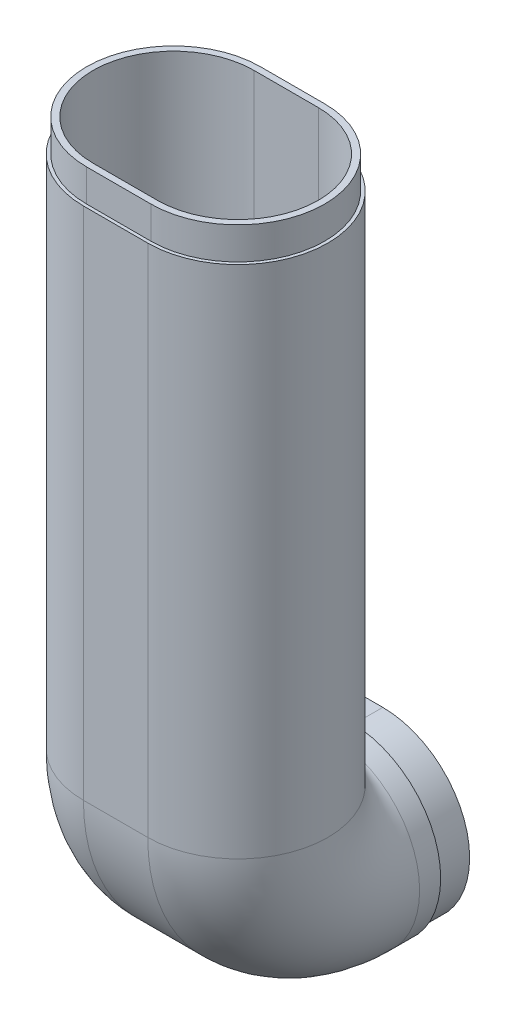
ISO-10303-21;
HEADER;
FILE_DESCRIPTION(('STEP AP214'),'2;1');
FILE_NAME('part.step','',(''),(''),'','','');
FILE_SCHEMA(('AUTOMOTIVE_DESIGN { 1 0 10303 214 1 1 1 1 }'));
ENDSEC;
DATA;
#1=APPLICATION_CONTEXT('core data for automotive mechanical design processes');
#2=APPLICATION_PROTOCOL_DEFINITION('international standard','automotive_design',2000,#1);
#3=PRODUCT_CONTEXT('',#1,'mechanical');
#4=PRODUCT('Part','Part','',(#3));
#5=PRODUCT_RELATED_PRODUCT_CATEGORY('part','',(#4));
#6=PRODUCT_DEFINITION_FORMATION('','',#4);
#7=PRODUCT_DEFINITION_CONTEXT('part definition',#1,'design');
#8=PRODUCT_DEFINITION('design','',#6,#7);
#9=PRODUCT_DEFINITION_SHAPE('','',#8);
#10=(LENGTH_UNIT() NAMED_UNIT(*) SI_UNIT(.MILLI.,.METRE.));
#11=(NAMED_UNIT(*) PLANE_ANGLE_UNIT() SI_UNIT($,.RADIAN.));
#12=(NAMED_UNIT(*) SI_UNIT($,.STERADIAN.) SOLID_ANGLE_UNIT());
#13=UNCERTAINTY_MEASURE_WITH_UNIT(LENGTH_MEASURE(1.E-05),#10,'distance_accuracy_value','');
#14=(GEOMETRIC_REPRESENTATION_CONTEXT(3) GLOBAL_UNCERTAINTY_ASSIGNED_CONTEXT((#13)) GLOBAL_UNIT_ASSIGNED_CONTEXT((#10,
#11,#12)) REPRESENTATION_CONTEXT('',''));
#15=CARTESIAN_POINT('',(0.,0.,0.));
#16=DIRECTION('',(0.,0.,1.));
#17=DIRECTION('',(1.,0.,0.));
#18=AXIS2_PLACEMENT_3D('',#15,#16,#17);
#19=CARTESIAN_POINT('',(-10.,198.51016359835,45.055914581086));
#20=DIRECTION('',(0.,1.,0.));
#21=DIRECTION('',(0.,0.,1.));
#22=AXIS2_PLACEMENT_3D('',#19,#20,#21);
#23=PLANE('',#22);
#24=DIRECTION('',(1.,0.,0.));
#25=VECTOR('',#24,1.);
#26=CARTESIAN_POINT('',(9.99999999999999,198.51016359835,70.0559145810861));
#27=LINE('',#26,#25);
#28=CARTESIAN_POINT('',(-10.,198.51016359835,70.0559145810861));
#29=VERTEX_POINT('',#28);
#30=CARTESIAN_POINT('',(9.99999999999999,198.51016359835,70.0559145810861));
#31=VERTEX_POINT('',#30);
#32=EDGE_CURVE('E279',#29,#31,#27,.T.);
#33=ORIENTED_EDGE('',*,*,#32,.F.);
#34=CARTESIAN_POINT('',(-10.,198.51016359835,45.055914581086));
#35=DIRECTION('',(0.,1.,0.));
#36=DIRECTION('',(0.,0.,1.));
#37=AXIS2_PLACEMENT_3D('',#34,#35,#36);
#38=CIRCLE('',#37,25.);
#39=CARTESIAN_POINT('',(-10.,198.51016359835,20.055914581086));
#40=VERTEX_POINT('',#39);
#41=EDGE_CURVE('E277',#40,#29,#38,.T.);
#42=ORIENTED_EDGE('',*,*,#41,.F.);
#43=DIRECTION('',(-1.,0.,0.));
#44=VECTOR('',#43,1.);
#45=CARTESIAN_POINT('',(9.99999999999999,198.51016359835,20.055914581086));
#46=LINE('',#45,#44);
#47=CARTESIAN_POINT('',(9.99999999999999,198.51016359835,20.055914581086));
#48=VERTEX_POINT('',#47);
#49=EDGE_CURVE('E284',#48,#40,#46,.T.);
#50=ORIENTED_EDGE('',*,*,#49,.F.);
#51=CARTESIAN_POINT('',(9.99999999999999,198.51016359835,45.055914581086));
#52=DIRECTION('',(0.,1.,0.));
#53=DIRECTION('',(0.,0.,1.));
#54=AXIS2_PLACEMENT_3D('',#51,#52,#53);
#55=CIRCLE('',#54,25.);
#56=EDGE_CURVE('E281',#31,#48,#55,.T.);
#57=ORIENTED_EDGE('',*,*,#56,.F.);
#58=EDGE_LOOP('',(#33,#42,#50,#57));
#59=FACE_BOUND('',#58,.T.);
#60=DIRECTION('',(-1.,0.,0.));
#61=VECTOR('',#60,1.);
#62=CARTESIAN_POINT('',(10.,198.51016359835,18.055914581086));
#63=LINE('',#62,#61);
#64=CARTESIAN_POINT('',(10.,198.51016359835,18.055914581086));
#65=VERTEX_POINT('',#64);
#66=CARTESIAN_POINT('',(-10.,198.51016359835,18.055914581086));
#67=VERTEX_POINT('',#66);
#68=EDGE_CURVE('E218',#65,#67,#63,.T.);
#69=ORIENTED_EDGE('',*,*,#68,.T.);
#70=CARTESIAN_POINT('',(-10.,198.51016359835,45.055914581086));
#71=DIRECTION('',(0.,1.,0.));
#72=DIRECTION('',(0.,0.,1.));
#73=AXIS2_PLACEMENT_3D('',#70,#71,#72);
#74=CIRCLE('',#73,27.);
#75=CARTESIAN_POINT('',(-10.,198.51016359835,72.0559145810861));
#76=VERTEX_POINT('',#75);
#77=EDGE_CURVE('E225',#67,#76,#74,.T.);
#78=ORIENTED_EDGE('',*,*,#77,.T.);
#79=DIRECTION('',(1.,0.,0.));
#80=VECTOR('',#79,1.);
#81=CARTESIAN_POINT('',(10.,198.51016359835,72.0559145810861));
#82=LINE('',#81,#80);
#83=CARTESIAN_POINT('',(10.,198.51016359835,72.0559145810861));
#84=VERTEX_POINT('',#83);
#85=EDGE_CURVE('E199',#76,#84,#82,.T.);
#86=ORIENTED_EDGE('',*,*,#85,.T.);
#87=CARTESIAN_POINT('',(10.,198.51016359835,45.055914581086));
#88=DIRECTION('',(0.,1.,0.));
#89=DIRECTION('',(0.,0.,-1.));
#90=AXIS2_PLACEMENT_3D('',#87,#88,#89);
#91=CIRCLE('',#90,27.);
#92=EDGE_CURVE('E48',#84,#65,#91,.T.);
#93=ORIENTED_EDGE('',*,*,#92,.T.);
#94=EDGE_LOOP('',(#69,#78,#86,#93));
#95=FACE_BOUND('',#94,.T.);
#96=ADVANCED_FACE('F33',(#59,#95),#23,.T.);
#97=CARTESIAN_POINT('',(-10.,198.51016359835,45.055914581086));
#98=DIRECTION('',(0.,-1.,0.));
#99=DIRECTION('',(0.,0.,-1.));
#100=AXIS2_PLACEMENT_3D('',#97,#98,#99);
#101=CYLINDRICAL_SURFACE('',#100,28.);
#102=CARTESIAN_POINT('',(-10.,188.51016359835,45.055914581086));
#103=DIRECTION('',(0.,1.,0.));
#104=DIRECTION('',(0.,0.,1.));
#105=AXIS2_PLACEMENT_3D('',#102,#103,#104);
#106=CIRCLE('',#105,28.);
#107=CARTESIAN_POINT('',(-10.,188.51016359835,17.055914581086));
#108=VERTEX_POINT('',#107);
#109=CARTESIAN_POINT('',(-10.,188.51016359835,73.055914581086));
#110=VERTEX_POINT('',#109);
#111=EDGE_CURVE('E236',#108,#110,#106,.T.);
#112=ORIENTED_EDGE('',*,*,#111,.F.);
#113=DIRECTION('',(0.,-1.,0.));
#114=VECTOR('',#113,1.);
#115=CARTESIAN_POINT('',(-10.,198.51016359835,17.055914581086));
#116=LINE('',#115,#114);
#117=CARTESIAN_POINT('',(-10.,28.5101635983498,17.055914581086));
#118=VERTEX_POINT('',#117);
#119=EDGE_CURVE('E298',#108,#118,#116,.T.);
#120=ORIENTED_EDGE('',*,*,#119,.T.);
#121=CARTESIAN_POINT('',(-10.,28.5101635983498,45.055914581086));
#122=DIRECTION('',(0.,1.,0.));
#123=DIRECTION('',(1.,0.,0.));
#124=AXIS2_PLACEMENT_3D('',#121,#122,#123);
#125=CIRCLE('',#124,28.);
#126=CARTESIAN_POINT('',(-10.,28.5101635983498,73.055914581086));
#127=VERTEX_POINT('',#126);
#128=EDGE_CURVE('E352',#118,#127,#125,.T.);
#129=ORIENTED_EDGE('',*,*,#128,.T.);
#130=DIRECTION('',(0.,-1.,0.));
#131=VECTOR('',#130,1.);
#132=CARTESIAN_POINT('',(-10.,198.51016359835,73.055914581086));
#133=LINE('',#132,#131);
#134=EDGE_CURVE('E304',#110,#127,#133,.T.);
#135=ORIENTED_EDGE('',*,*,#134,.F.);
#136=EDGE_LOOP('',(#112,#120,#129,#135));
#137=FACE_BOUND('',#136,.T.);
#138=ADVANCED_FACE('F453',(#137),#101,.T.);
#139=CARTESIAN_POINT('',(9.99999999999999,198.51016359835,73.055914581086));
#140=DIRECTION('',(0.,0.,-1.));
#141=DIRECTION('',(-1.,0.,0.));
#142=AXIS2_PLACEMENT_3D('',#139,#140,#141);
#143=PLANE('',#142);
#144=DIRECTION('',(1.,0.,0.));
#145=VECTOR('',#144,1.);
#146=CARTESIAN_POINT('',(9.99999999999999,188.51016359835,73.055914581086));
#147=LINE('',#146,#145);
#148=CARTESIAN_POINT('',(9.99999999999999,188.51016359835,73.055914581086));
#149=VERTEX_POINT('',#148);
#150=EDGE_CURVE('E234',#110,#149,#147,.T.);
#151=ORIENTED_EDGE('',*,*,#150,.F.);
#152=ORIENTED_EDGE('',*,*,#134,.T.);
#153=DIRECTION('',(1.,0.,0.));
#154=VECTOR('',#153,1.);
#155=CARTESIAN_POINT('',(-10.,28.5101635983498,73.055914581086));
#156=LINE('',#155,#154);
#157=CARTESIAN_POINT('',(9.99999999999999,28.5101635983498,73.055914581086));
#158=VERTEX_POINT('',#157);
#159=EDGE_CURVE('E349',#127,#158,#156,.T.);
#160=ORIENTED_EDGE('',*,*,#159,.T.);
#161=DIRECTION('',(0.,-1.,0.));
#162=VECTOR('',#161,1.);
#163=CARTESIAN_POINT('',(9.99999999999999,198.51016359835,73.055914581086));
#164=LINE('',#163,#162);
#165=EDGE_CURVE('E302',#149,#158,#164,.T.);
#166=ORIENTED_EDGE('',*,*,#165,.F.);
#167=EDGE_LOOP('',(#151,#152,#160,#166));
#168=FACE_BOUND('',#167,.T.);
#169=ADVANCED_FACE('F459',(#168),#143,.F.);
#170=CARTESIAN_POINT('',(9.99999999999999,198.51016359835,45.055914581086));
#171=DIRECTION('',(0.,-1.,0.));
#172=DIRECTION('',(0.,0.,-1.));
#173=AXIS2_PLACEMENT_3D('',#170,#171,#172);
#174=CYLINDRICAL_SURFACE('',#173,28.);
#175=CARTESIAN_POINT('',(9.99999999999999,188.51016359835,45.055914581086));
#176=DIRECTION('',(0.,1.,0.));
#177=DIRECTION('',(0.,0.,1.));
#178=AXIS2_PLACEMENT_3D('',#175,#176,#177);
#179=CIRCLE('',#178,28.);
#180=CARTESIAN_POINT('',(9.99999999999999,188.51016359835,17.055914581086));
#181=VERTEX_POINT('',#180);
#182=EDGE_CURVE('E55',#149,#181,#179,.T.);
#183=ORIENTED_EDGE('',*,*,#182,.F.);
#184=ORIENTED_EDGE('',*,*,#165,.T.);
#185=CARTESIAN_POINT('',(9.99999999999999,28.5101635983498,45.055914581086));
#186=DIRECTION('',(0.,1.,0.));
#187=DIRECTION('',(1.,0.,0.));
#188=AXIS2_PLACEMENT_3D('',#185,#186,#187);
#189=CIRCLE('',#188,28.);
#190=CARTESIAN_POINT('',(10.,28.5101635983498,17.055914581086));
#191=VERTEX_POINT('',#190);
#192=EDGE_CURVE('E346',#158,#191,#189,.T.);
#193=ORIENTED_EDGE('',*,*,#192,.T.);
#194=DIRECTION('',(0.,-1.,0.));
#195=VECTOR('',#194,1.);
#196=CARTESIAN_POINT('',(9.99999999999999,198.51016359835,17.055914581086));
#197=LINE('',#196,#195);
#198=EDGE_CURVE('E300',#181,#191,#197,.T.);
#199=ORIENTED_EDGE('',*,*,#198,.F.);
#200=EDGE_LOOP('',(#183,#184,#193,#199));
#201=FACE_BOUND('',#200,.T.);
#202=ADVANCED_FACE('F470',(#201),#174,.T.);
#203=CARTESIAN_POINT('',(9.99999999999999,198.51016359835,17.055914581086));
#204=DIRECTION('',(0.,0.,1.));
#205=DIRECTION('',(1.,0.,0.));
#206=AXIS2_PLACEMENT_3D('',#203,#204,#205);
#207=PLANE('',#206);
#208=DIRECTION('',(-1.,0.,0.));
#209=VECTOR('',#208,1.);
#210=CARTESIAN_POINT('',(9.99999999999999,188.51016359835,17.055914581086));
#211=LINE('',#210,#209);
#212=EDGE_CURVE('E11',#181,#108,#211,.T.);
#213=ORIENTED_EDGE('',*,*,#212,.F.);
#214=ORIENTED_EDGE('',*,*,#198,.T.);
#215=DIRECTION('',(-1.,0.,0.));
#216=VECTOR('',#215,1.);
#217=CARTESIAN_POINT('',(10.,28.5101635983498,17.055914581086));
#218=LINE('',#217,#216);
#219=EDGE_CURVE('E311',#191,#118,#218,.T.);
#220=ORIENTED_EDGE('',*,*,#219,.T.);
#221=ORIENTED_EDGE('',*,*,#119,.F.);
#222=EDGE_LOOP('',(#213,#214,#220,#221));
#223=FACE_BOUND('',#222,.T.);
#224=ADVANCED_FACE('F449',(#223),#207,.F.);
#225=CARTESIAN_POINT('',(-10.,0.,0.));
#226=DIRECTION('',(0.,0.,1.));
#227=DIRECTION('',(1.,0.,0.));
#228=AXIS2_PLACEMENT_3D('',#225,#226,#227);
#229=PLANE('',#228);
#230=CARTESIAN_POINT('',(-10.,0.,0.));
#231=DIRECTION('',(0.,0.,1.));
#232=DIRECTION('',(1.,0.,0.));
#233=AXIS2_PLACEMENT_3D('',#230,#231,#232);
#234=CIRCLE('',#233,25.);
#235=CARTESIAN_POINT('',(-10.,25.,0.));
#236=VERTEX_POINT('',#235);
#237=CARTESIAN_POINT('',(-10.,-25.,0.));
#238=VERTEX_POINT('',#237);
#239=EDGE_CURVE('E343',#236,#238,#234,.T.);
#240=ORIENTED_EDGE('',*,*,#239,.T.);
#241=DIRECTION('',(1.,0.,0.));
#242=VECTOR('',#241,1.);
#243=CARTESIAN_POINT('',(10.,-25.,0.));
#244=LINE('',#243,#242);
#245=CARTESIAN_POINT('',(9.99999999999999,-25.,0.));
#246=VERTEX_POINT('',#245);
#247=EDGE_CURVE('E380',#238,#246,#244,.T.);
#248=ORIENTED_EDGE('',*,*,#247,.T.);
#249=CARTESIAN_POINT('',(9.99999999999999,0.,0.));
#250=DIRECTION('',(0.,0.,1.));
#251=DIRECTION('',(1.,0.,0.));
#252=AXIS2_PLACEMENT_3D('',#249,#250,#251);
#253=CIRCLE('',#252,25.);
#254=CARTESIAN_POINT('',(10.,25.,0.));
#255=VERTEX_POINT('',#254);
#256=EDGE_CURVE('E383',#246,#255,#253,.T.);
#257=ORIENTED_EDGE('',*,*,#256,.T.);
#258=DIRECTION('',(-1.,0.,0.));
#259=VECTOR('',#258,1.);
#260=CARTESIAN_POINT('',(10.,25.,0.));
#261=LINE('',#260,#259);
#262=EDGE_CURVE('E386',#255,#236,#261,.T.);
#263=ORIENTED_EDGE('',*,*,#262,.T.);
#264=EDGE_LOOP('',(#240,#248,#257,#263));
#265=FACE_BOUND('',#264,.T.);
#266=CARTESIAN_POINT('',(10.,0.,0.));
#267=DIRECTION('',(0.,0.,-1.));
#268=DIRECTION('',(-1.,0.,0.));
#269=AXIS2_PLACEMENT_3D('',#266,#267,#268);
#270=CIRCLE('',#269,27.);
#271=CARTESIAN_POINT('',(10.,27.,0.));
#272=VERTEX_POINT('',#271);
#273=CARTESIAN_POINT('',(10.,-27.,0.));
#274=VERTEX_POINT('',#273);
#275=EDGE_CURVE('E238',#272,#274,#270,.T.);
#276=ORIENTED_EDGE('',*,*,#275,.T.);
#277=DIRECTION('',(-1.,0.,0.));
#278=VECTOR('',#277,1.);
#279=CARTESIAN_POINT('',(-10.,-27.,0.));
#280=LINE('',#279,#278);
#281=CARTESIAN_POINT('',(-10.,-27.,0.));
#282=VERTEX_POINT('',#281);
#283=EDGE_CURVE('E255',#274,#282,#280,.T.);
#284=ORIENTED_EDGE('',*,*,#283,.T.);
#285=CARTESIAN_POINT('',(-10.,0.,0.));
#286=DIRECTION('',(0.,0.,-1.));
#287=DIRECTION('',(1.,0.,0.));
#288=AXIS2_PLACEMENT_3D('',#285,#286,#287);
#289=CIRCLE('',#288,27.);
#290=CARTESIAN_POINT('',(-10.,27.,0.));
#291=VERTEX_POINT('',#290);
#292=EDGE_CURVE('E258',#282,#291,#289,.T.);
#293=ORIENTED_EDGE('',*,*,#292,.T.);
#294=DIRECTION('',(1.,0.,0.));
#295=VECTOR('',#294,1.);
#296=CARTESIAN_POINT('',(-10.,27.,0.));
#297=LINE('',#296,#295);
#298=EDGE_CURVE('E243',#291,#272,#297,.T.);
#299=ORIENTED_EDGE('',*,*,#298,.T.);
#300=EDGE_LOOP('',(#276,#284,#293,#299));
#301=FACE_BOUND('',#300,.T.);
#302=ADVANCED_FACE('F444',(#265,#301),#229,.F.);
#303=CARTESIAN_POINT('',(-10.,0.,12.));
#304=DIRECTION('',(0.,0.,-1.));
#305=DIRECTION('',(-1.,0.,0.));
#306=AXIS2_PLACEMENT_3D('',#303,#304,#305);
#307=CYLINDRICAL_SURFACE('',#306,28.);
#308=CARTESIAN_POINT('',(-10.,0.,10.));
#309=DIRECTION('',(0.,0.,-1.));
#310=DIRECTION('',(-1.,0.,0.));
#311=AXIS2_PLACEMENT_3D('',#308,#309,#310);
#312=CIRCLE('',#311,28.);
#313=CARTESIAN_POINT('',(-10.,-28.,10.));
#314=VERTEX_POINT('',#313);
#315=CARTESIAN_POINT('',(-10.,28.,10.));
#316=VERTEX_POINT('',#315);
#317=EDGE_CURVE('E275',#314,#316,#312,.T.);
#318=ORIENTED_EDGE('',*,*,#317,.F.);
#319=DIRECTION('',(0.,0.,-1.));
#320=VECTOR('',#319,1.);
#321=CARTESIAN_POINT('',(-10.,-28.,12.));
#322=LINE('',#321,#320);
#323=CARTESIAN_POINT('',(-10.,-28.,16.5457509827363));
#324=VERTEX_POINT('',#323);
#325=EDGE_CURVE('E408',#324,#314,#322,.T.);
#326=ORIENTED_EDGE('',*,*,#325,.F.);
#327=CARTESIAN_POINT('',(-10.,0.,16.5457509827363));
#328=DIRECTION('',(0.,0.,1.));
#329=DIRECTION('',(1.,0.,0.));
#330=AXIS2_PLACEMENT_3D('',#327,#328,#329);
#331=CIRCLE('',#330,28.);
#332=CARTESIAN_POINT('',(-10.,28.,16.5457509827363));
#333=VERTEX_POINT('',#332);
#334=EDGE_CURVE('E358',#333,#324,#331,.T.);
#335=ORIENTED_EDGE('',*,*,#334,.F.);
#336=DIRECTION('',(0.,0.,-1.));
#337=VECTOR('',#336,1.);
#338=CARTESIAN_POINT('',(-10.,28.,12.));
#339=LINE('',#338,#337);
#340=EDGE_CURVE('E399',#333,#316,#339,.T.);
#341=ORIENTED_EDGE('',*,*,#340,.T.);
#342=EDGE_LOOP('',(#318,#326,#335,#341));
#343=FACE_BOUND('',#342,.T.);
#344=ADVANCED_FACE('F35',(#343),#307,.T.);
#345=CARTESIAN_POINT('',(9.99999999999999,-28.,12.));
#346=DIRECTION('',(0.,1.,0.));
#347=DIRECTION('',(-1.,0.,0.));
#348=AXIS2_PLACEMENT_3D('',#345,#346,#347);
#349=PLANE('',#348);
#350=DIRECTION('',(-1.,0.,0.));
#351=VECTOR('',#350,1.);
#352=CARTESIAN_POINT('',(9.99999999999999,-28.,10.));
#353=LINE('',#352,#351);
#354=CARTESIAN_POINT('',(9.99999999999999,-28.,10.));
#355=VERTEX_POINT('',#354);
#356=EDGE_CURVE('E273',#355,#314,#353,.T.);
#357=ORIENTED_EDGE('',*,*,#356,.F.);
#358=DIRECTION('',(0.,0.,-1.));
#359=VECTOR('',#358,1.);
#360=CARTESIAN_POINT('',(9.99999999999999,-28.,12.));
#361=LINE('',#360,#359);
#362=CARTESIAN_POINT('',(9.99999999999999,-28.,16.5457509827363));
#363=VERTEX_POINT('',#362);
#364=EDGE_CURVE('E405',#363,#355,#361,.T.);
#365=ORIENTED_EDGE('',*,*,#364,.F.);
#366=DIRECTION('',(1.,0.,0.));
#367=VECTOR('',#366,1.);
#368=CARTESIAN_POINT('',(-10.,-28.,16.5457509827363));
#369=LINE('',#368,#367);
#370=EDGE_CURVE('E369',#324,#363,#369,.T.);
#371=ORIENTED_EDGE('',*,*,#370,.F.);
#372=ORIENTED_EDGE('',*,*,#325,.T.);
#373=EDGE_LOOP('',(#357,#365,#371,#372));
#374=FACE_BOUND('',#373,.T.);
#375=ADVANCED_FACE('F438',(#374),#349,.F.);
#376=CARTESIAN_POINT('',(9.99999999999999,0.,12.));
#377=DIRECTION('',(0.,0.,-1.));
#378=DIRECTION('',(-1.,0.,0.));
#379=AXIS2_PLACEMENT_3D('',#376,#377,#378);
#380=CYLINDRICAL_SURFACE('',#379,28.);
#381=CARTESIAN_POINT('',(9.99999999999999,0.,10.));
#382=DIRECTION('',(0.,0.,-1.));
#383=DIRECTION('',(-1.,0.,0.));
#384=AXIS2_PLACEMENT_3D('',#381,#382,#383);
#385=CIRCLE('',#384,28.);
#386=CARTESIAN_POINT('',(10.,28.,10.));
#387=VERTEX_POINT('',#386);
#388=EDGE_CURVE('E265',#387,#355,#385,.T.);
#389=ORIENTED_EDGE('',*,*,#388,.F.);
#390=DIRECTION('',(0.,0.,-1.));
#391=VECTOR('',#390,1.);
#392=CARTESIAN_POINT('',(9.99999999999999,28.,12.));
#393=LINE('',#392,#391);
#394=CARTESIAN_POINT('',(10.,28.,16.5457509827363));
#395=VERTEX_POINT('',#394);
#396=EDGE_CURVE('E402',#395,#387,#393,.T.);
#397=ORIENTED_EDGE('',*,*,#396,.F.);
#398=CARTESIAN_POINT('',(9.99999999999999,0.,16.5457509827363));
#399=DIRECTION('',(0.,0.,1.));
#400=DIRECTION('',(1.,0.,0.));
#401=AXIS2_PLACEMENT_3D('',#398,#399,#400);
#402=CIRCLE('',#401,28.);
#403=EDGE_CURVE('E366',#363,#395,#402,.T.);
#404=ORIENTED_EDGE('',*,*,#403,.F.);
#405=ORIENTED_EDGE('',*,*,#364,.T.);
#406=EDGE_LOOP('',(#389,#397,#404,#405));
#407=FACE_BOUND('',#406,.T.);
#408=ADVANCED_FACE('F418',(#407),#380,.T.);
#409=CARTESIAN_POINT('',(9.99999999999999,28.,12.));
#410=DIRECTION('',(0.,-1.,0.));
#411=DIRECTION('',(0.,0.,-1.));
#412=AXIS2_PLACEMENT_3D('',#409,#410,#411);
#413=PLANE('',#412);
#414=DIRECTION('',(1.,0.,0.));
#415=VECTOR('',#414,1.);
#416=CARTESIAN_POINT('',(9.99999999999999,28.,10.));
#417=LINE('',#416,#415);
#418=EDGE_CURVE('E41',#316,#387,#417,.T.);
#419=ORIENTED_EDGE('',*,*,#418,.F.);
#420=ORIENTED_EDGE('',*,*,#340,.F.);
#421=DIRECTION('',(-1.,0.,0.));
#422=VECTOR('',#421,1.);
#423=CARTESIAN_POINT('',(10.,28.,16.5457509827363));
#424=LINE('',#423,#422);
#425=EDGE_CURVE('E306',#395,#333,#424,.T.);
#426=ORIENTED_EDGE('',*,*,#425,.F.);
#427=ORIENTED_EDGE('',*,*,#396,.T.);
#428=EDGE_LOOP('',(#419,#420,#426,#427));
#429=FACE_BOUND('',#428,.T.);
#430=ADVANCED_FACE('F422',(#429),#413,.F.);
#431=CARTESIAN_POINT('',(-10.,0.,12.));
#432=DIRECTION('',(0.,0.,-1.));
#433=DIRECTION('',(-1.,0.,0.));
#434=AXIS2_PLACEMENT_3D('',#431,#432,#433);
#435=CYLINDRICAL_SURFACE('',#434,25.);
#436=ORIENTED_EDGE('',*,*,#239,.F.);
#437=DIRECTION('',(0.,0.,-1.));
#438=VECTOR('',#437,1.);
#439=CARTESIAN_POINT('',(-10.,25.,12.));
#440=LINE('',#439,#438);
#441=CARTESIAN_POINT('',(-10.,25.,16.5457509827363));
#442=VERTEX_POINT('',#441);
#443=EDGE_CURVE('E389',#442,#236,#440,.T.);
#444=ORIENTED_EDGE('',*,*,#443,.F.);
#445=CARTESIAN_POINT('',(-10.,0.,16.5457509827363));
#446=DIRECTION('',(0.,0.,1.));
#447=DIRECTION('',(1.,0.,0.));
#448=AXIS2_PLACEMENT_3D('',#445,#446,#447);
#449=CIRCLE('',#448,25.);
#450=CARTESIAN_POINT('',(-10.,-25.,16.5457509827363));
#451=VERTEX_POINT('',#450);
#452=EDGE_CURVE('E324',#451,#442,#449,.F.);
#453=ORIENTED_EDGE('',*,*,#452,.F.);
#454=DIRECTION('',(0.,0.,-1.));
#455=VECTOR('',#454,1.);
#456=CARTESIAN_POINT('',(-10.,-25.,12.));
#457=LINE('',#456,#455);
#458=EDGE_CURVE('E396',#451,#238,#457,.T.);
#459=ORIENTED_EDGE('',*,*,#458,.T.);
#460=EDGE_LOOP('',(#436,#444,#453,#459));
#461=FACE_BOUND('',#460,.T.);
#462=ADVANCED_FACE('F513',(#461),#435,.F.);
#463=CARTESIAN_POINT('',(10.,-25.,12.));
#464=DIRECTION('',(0.,1.,0.));
#465=DIRECTION('',(0.,0.,1.));
#466=AXIS2_PLACEMENT_3D('',#463,#464,#465);
#467=PLANE('',#466);
#468=ORIENTED_EDGE('',*,*,#247,.F.);
#469=ORIENTED_EDGE('',*,*,#458,.F.);
#470=DIRECTION('',(1.,0.,0.));
#471=VECTOR('',#470,1.);
#472=CARTESIAN_POINT('',(-10.,-25.,16.5457509827363));
#473=LINE('',#472,#471);
#474=CARTESIAN_POINT('',(9.99999999999999,-25.,16.5457509827363));
#475=VERTEX_POINT('',#474);
#476=EDGE_CURVE('E310',#475,#451,#473,.F.);
#477=ORIENTED_EDGE('',*,*,#476,.F.);
#478=DIRECTION('',(0.,0.,-1.));
#479=VECTOR('',#478,1.);
#480=CARTESIAN_POINT('',(9.99999999999999,-25.,12.));
#481=LINE('',#480,#479);
#482=EDGE_CURVE('E394',#475,#246,#481,.T.);
#483=ORIENTED_EDGE('',*,*,#482,.T.);
#484=EDGE_LOOP('',(#468,#469,#477,#483));
#485=FACE_BOUND('',#484,.T.);
#486=ADVANCED_FACE('F509',(#485),#467,.T.);
#487=CARTESIAN_POINT('',(9.99999999999999,0.,12.));
#488=DIRECTION('',(0.,0.,-1.));
#489=DIRECTION('',(-1.,0.,0.));
#490=AXIS2_PLACEMENT_3D('',#487,#488,#489);
#491=CYLINDRICAL_SURFACE('',#490,25.);
#492=ORIENTED_EDGE('',*,*,#256,.F.);
#493=ORIENTED_EDGE('',*,*,#482,.F.);
#494=CARTESIAN_POINT('',(9.99999999999999,0.,16.5457509827363));
#495=DIRECTION('',(0.,0.,1.));
#496=DIRECTION('',(1.,0.,0.));
#497=AXIS2_PLACEMENT_3D('',#494,#495,#496);
#498=CIRCLE('',#497,25.);
#499=CARTESIAN_POINT('',(10.,25.,16.5457509827363));
#500=VERTEX_POINT('',#499);
#501=EDGE_CURVE('E307',#500,#475,#498,.F.);
#502=ORIENTED_EDGE('',*,*,#501,.F.);
#503=DIRECTION('',(0.,0.,-1.));
#504=VECTOR('',#503,1.);
#505=CARTESIAN_POINT('',(10.,25.,12.));
#506=LINE('',#505,#504);
#507=EDGE_CURVE('E392',#500,#255,#506,.T.);
#508=ORIENTED_EDGE('',*,*,#507,.T.);
#509=EDGE_LOOP('',(#492,#493,#502,#508));
#510=FACE_BOUND('',#509,.T.);
#511=ADVANCED_FACE('F505',(#510),#491,.F.);
#512=CARTESIAN_POINT('',(10.,25.,12.));
#513=DIRECTION('',(0.,-1.,0.));
#514=DIRECTION('',(0.,0.,-1.));
#515=AXIS2_PLACEMENT_3D('',#512,#513,#514);
#516=PLANE('',#515);
#517=ORIENTED_EDGE('',*,*,#262,.F.);
#518=ORIENTED_EDGE('',*,*,#507,.F.);
#519=DIRECTION('',(-1.,0.,0.));
#520=VECTOR('',#519,1.);
#521=CARTESIAN_POINT('',(10.,25.,16.5457509827363));
#522=LINE('',#521,#520);
#523=EDGE_CURVE('E321',#442,#500,#522,.F.);
#524=ORIENTED_EDGE('',*,*,#523,.F.);
#525=ORIENTED_EDGE('',*,*,#443,.T.);
#526=EDGE_LOOP('',(#517,#518,#524,#525));
#527=FACE_BOUND('',#526,.T.);
#528=ADVANCED_FACE('F494',(#527),#516,.T.);
#529=CARTESIAN_POINT('',(0.,28.5101635983498,16.5457509827363));
#530=DIRECTION('',(-1.,0.,0.));
#531=DIRECTION('',(0.,0.,1.));
#532=AXIS2_PLACEMENT_3D('',#529,#530,#531);
#533=CYLINDRICAL_SURFACE('',#532,0.510163598349786);
#534=CARTESIAN_POINT('',(-10.,28.5101635983498,16.5457509827363));
#535=DIRECTION('',(-1.,0.,0.));
#536=DIRECTION('',(0.,-1.,0.));
#537=AXIS2_PLACEMENT_3D('',#534,#535,#536);
#538=CIRCLE('',#537,0.510163598349784);
#539=EDGE_CURVE('E359',#333,#118,#538,.T.);
#540=ORIENTED_EDGE('',*,*,#539,.T.);
#541=ORIENTED_EDGE('',*,*,#219,.F.);
#542=CARTESIAN_POINT('',(10.,28.5101635983498,16.5457509827363));
#543=DIRECTION('',(-1.,0.,0.));
#544=DIRECTION('',(0.,-1.,0.));
#545=AXIS2_PLACEMENT_3D('',#542,#543,#544);
#546=CIRCLE('',#545,0.510163598349787);
#547=EDGE_CURVE('E363',#395,#191,#546,.T.);
#548=ORIENTED_EDGE('',*,*,#547,.F.);
#549=ORIENTED_EDGE('',*,*,#425,.T.);
#550=EDGE_LOOP('',(#540,#541,#548,#549));
#551=FACE_BOUND('',#550,.T.);
#552=ADVANCED_FACE('F425',(#551),#533,.F.);
#553=CARTESIAN_POINT('',(-10.,28.5101635983498,16.5457509827363));
#554=DIRECTION('',(-1.,0.,0.));
#555=DIRECTION('',(0.,0.,1.));
#556=AXIS2_PLACEMENT_3D('',#553,#554,#555);
#557=TOROIDAL_SURFACE('',#556,28.5101635983498,28.);
#558=CARTESIAN_POINT('',(-10.,28.5101635983498,16.5457509827363));
#559=DIRECTION('',(-1.,0.,0.));
#560=DIRECTION('',(0.,-1.,0.));
#561=AXIS2_PLACEMENT_3D('',#558,#559,#560);
#562=CIRCLE('',#561,56.5101635983498);
#563=EDGE_CURVE('E362',#324,#127,#562,.T.);
#564=ORIENTED_EDGE('',*,*,#563,.T.);
#565=ORIENTED_EDGE('',*,*,#128,.F.);
#566=ORIENTED_EDGE('',*,*,#539,.F.);
#567=ORIENTED_EDGE('',*,*,#334,.T.);
#568=EDGE_LOOP('',(#564,#565,#566,#567));
#569=FACE_BOUND('',#568,.T.);
#570=ADVANCED_FACE('F441',(#569),#557,.T.);
#571=CARTESIAN_POINT('',(0.,28.5101635983498,16.5457509827363));
#572=DIRECTION('',(-1.,0.,0.));
#573=DIRECTION('',(0.,0.,1.));
#574=AXIS2_PLACEMENT_3D('',#571,#572,#573);
#575=CYLINDRICAL_SURFACE('',#574,56.5101635983498);
#576=CARTESIAN_POINT('',(9.99999999999999,28.5101635983498,16.5457509827363));
#577=DIRECTION('',(-1.,0.,0.));
#578=DIRECTION('',(0.,-1.,0.));
#579=AXIS2_PLACEMENT_3D('',#576,#577,#578);
#580=CIRCLE('',#579,56.5101635983498);
#581=EDGE_CURVE('E355',#363,#158,#580,.T.);
#582=ORIENTED_EDGE('',*,*,#581,.T.);
#583=ORIENTED_EDGE('',*,*,#159,.F.);
#584=ORIENTED_EDGE('',*,*,#563,.F.);
#585=ORIENTED_EDGE('',*,*,#370,.T.);
#586=EDGE_LOOP('',(#582,#583,#584,#585));
#587=FACE_BOUND('',#586,.T.);
#588=ADVANCED_FACE('F435',(#587),#575,.T.);
#589=CARTESIAN_POINT('',(9.99999999999999,28.5101635983498,16.5457509827363));
#590=DIRECTION('',(-1.,0.,0.));
#591=DIRECTION('',(0.,0.,1.));
#592=AXIS2_PLACEMENT_3D('',#589,#590,#591);
#593=TOROIDAL_SURFACE('',#592,28.5101635983498,28.);
#594=ORIENTED_EDGE('',*,*,#192,.F.);
#595=ORIENTED_EDGE('',*,*,#581,.F.);
#596=ORIENTED_EDGE('',*,*,#403,.T.);
#597=ORIENTED_EDGE('',*,*,#547,.T.);
#598=EDGE_LOOP('',(#594,#595,#596,#597));
#599=FACE_BOUND('',#598,.T.);
#600=ADVANCED_FACE('F431',(#599),#593,.T.);
#601=CARTESIAN_POINT('',(9.99999999999999,28.5101635983498,16.5457509827363));
#602=DIRECTION('',(-1.,0.,0.));
#603=DIRECTION('',(0.,0.,1.));
#604=AXIS2_PLACEMENT_3D('',#601,#602,#603);
#605=TOROIDAL_SURFACE('',#604,28.5101635983498,25.);
#606=CARTESIAN_POINT('',(9.99999999999999,28.5101635983498,16.5457509827363));
#607=DIRECTION('',(-1.,0.,0.));
#608=DIRECTION('',(0.,-1.,0.));
#609=AXIS2_PLACEMENT_3D('',#606,#607,#608);
#610=CIRCLE('',#609,53.5101635983498);
#611=CARTESIAN_POINT('',(9.99999999999999,28.5101635983498,70.055914581086));
#612=VERTEX_POINT('',#611);
#613=EDGE_CURVE('E315',#475,#612,#610,.T.);
#614=ORIENTED_EDGE('',*,*,#613,.T.);
#615=CARTESIAN_POINT('',(9.99999999999999,28.5101635983498,45.055914581086));
#616=DIRECTION('',(0.,1.,0.));
#617=DIRECTION('',(1.,0.,0.));
#618=AXIS2_PLACEMENT_3D('',#615,#616,#617);
#619=CIRCLE('',#618,25.);
#620=CARTESIAN_POINT('',(9.99999999999999,28.5101635983498,20.055914581086));
#621=VERTEX_POINT('',#620);
#622=EDGE_CURVE('E312',#621,#612,#619,.F.);
#623=ORIENTED_EDGE('',*,*,#622,.F.);
#624=CARTESIAN_POINT('',(10.,28.5101635983498,16.5457509827363));
#625=DIRECTION('',(-1.,0.,0.));
#626=DIRECTION('',(0.,-1.,0.));
#627=AXIS2_PLACEMENT_3D('',#624,#625,#626);
#628=CIRCLE('',#627,3.51016359834979);
#629=EDGE_CURVE('E316',#500,#621,#628,.T.);
#630=ORIENTED_EDGE('',*,*,#629,.F.);
#631=ORIENTED_EDGE('',*,*,#501,.T.);
#632=EDGE_LOOP('',(#614,#623,#630,#631));
#633=FACE_BOUND('',#632,.T.);
#634=ADVANCED_FACE('F478',(#633),#605,.F.);
#635=CARTESIAN_POINT('',(0.,28.5101635983498,16.5457509827363));
#636=DIRECTION('',(-1.,0.,0.));
#637=DIRECTION('',(0.,0.,1.));
#638=AXIS2_PLACEMENT_3D('',#635,#636,#637);
#639=CYLINDRICAL_SURFACE('',#638,53.5101635983498);
#640=CARTESIAN_POINT('',(-10.,28.5101635983498,16.5457509827363));
#641=DIRECTION('',(-1.,0.,0.));
#642=DIRECTION('',(0.,-1.,0.));
#643=AXIS2_PLACEMENT_3D('',#640,#641,#642);
#644=CIRCLE('',#643,53.5101635983498);
#645=CARTESIAN_POINT('',(-10.,28.5101635983498,70.0559145810861));
#646=VERTEX_POINT('',#645);
#647=EDGE_CURVE('E327',#451,#646,#644,.T.);
#648=ORIENTED_EDGE('',*,*,#647,.T.);
#649=DIRECTION('',(1.,0.,0.));
#650=VECTOR('',#649,1.);
#651=CARTESIAN_POINT('',(-10.,28.5101635983498,70.0559145810861));
#652=LINE('',#651,#650);
#653=EDGE_CURVE('E319',#612,#646,#652,.F.);
#654=ORIENTED_EDGE('',*,*,#653,.F.);
#655=ORIENTED_EDGE('',*,*,#613,.F.);
#656=ORIENTED_EDGE('',*,*,#476,.T.);
#657=EDGE_LOOP('',(#648,#654,#655,#656));
#658=FACE_BOUND('',#657,.T.);
#659=ADVANCED_FACE('F481',(#658),#639,.F.);
#660=CARTESIAN_POINT('',(-10.,28.5101635983498,16.5457509827363));
#661=DIRECTION('',(-1.,0.,0.));
#662=DIRECTION('',(0.,0.,1.));
#663=AXIS2_PLACEMENT_3D('',#660,#661,#662);
#664=TOROIDAL_SURFACE('',#663,28.5101635983498,25.);
#665=CARTESIAN_POINT('',(-10.,28.5101635983498,16.5457509827363));
#666=DIRECTION('',(-1.,0.,0.));
#667=DIRECTION('',(0.,-1.,0.));
#668=AXIS2_PLACEMENT_3D('',#665,#666,#667);
#669=CIRCLE('',#668,3.51016359834978);
#670=CARTESIAN_POINT('',(-10.,28.5101635983498,20.055914581086));
#671=VERTEX_POINT('',#670);
#672=EDGE_CURVE('E335',#442,#671,#669,.T.);
#673=ORIENTED_EDGE('',*,*,#672,.T.);
#674=CARTESIAN_POINT('',(-10.,28.5101635983498,45.055914581086));
#675=DIRECTION('',(0.,1.,0.));
#676=DIRECTION('',(1.,0.,0.));
#677=AXIS2_PLACEMENT_3D('',#674,#675,#676);
#678=CIRCLE('',#677,25.);
#679=EDGE_CURVE('E330',#646,#671,#678,.F.);
#680=ORIENTED_EDGE('',*,*,#679,.F.);
#681=ORIENTED_EDGE('',*,*,#647,.F.);
#682=ORIENTED_EDGE('',*,*,#452,.T.);
#683=EDGE_LOOP('',(#673,#680,#681,#682));
#684=FACE_BOUND('',#683,.T.);
#685=ADVANCED_FACE('F485',(#684),#664,.F.);
#686=CARTESIAN_POINT('',(0.,28.5101635983498,16.5457509827363));
#687=DIRECTION('',(-1.,0.,0.));
#688=DIRECTION('',(0.,0.,1.));
#689=AXIS2_PLACEMENT_3D('',#686,#687,#688);
#690=CYLINDRICAL_SURFACE('',#689,3.51016359834979);
#691=DIRECTION('',(-1.,0.,0.));
#692=VECTOR('',#691,1.);
#693=CARTESIAN_POINT('',(10.,28.5101635983498,20.055914581086));
#694=LINE('',#693,#692);
#695=EDGE_CURVE('E338',#671,#621,#694,.F.);
#696=ORIENTED_EDGE('',*,*,#695,.F.);
#697=ORIENTED_EDGE('',*,*,#672,.F.);
#698=ORIENTED_EDGE('',*,*,#523,.T.);
#699=ORIENTED_EDGE('',*,*,#629,.T.);
#700=EDGE_LOOP('',(#696,#697,#698,#699));
#701=FACE_BOUND('',#700,.T.);
#702=ADVANCED_FACE('F489',(#701),#690,.T.);
#703=CARTESIAN_POINT('',(-10.,198.51016359835,45.055914581086));
#704=DIRECTION('',(0.,-1.,0.));
#705=DIRECTION('',(0.,0.,-1.));
#706=AXIS2_PLACEMENT_3D('',#703,#704,#705);
#707=CYLINDRICAL_SURFACE('',#706,25.);
#708=ORIENTED_EDGE('',*,*,#679,.T.);
#709=DIRECTION('',(0.,-1.,0.));
#710=VECTOR('',#709,1.);
#711=CARTESIAN_POINT('',(-10.,198.51016359835,20.055914581086));
#712=LINE('',#711,#710);
#713=EDGE_CURVE('E286',#40,#671,#712,.T.);
#714=ORIENTED_EDGE('',*,*,#713,.F.);
#715=ORIENTED_EDGE('',*,*,#41,.T.);
#716=DIRECTION('',(0.,-1.,0.));
#717=VECTOR('',#716,1.);
#718=CARTESIAN_POINT('',(-10.,198.51016359835,70.0559145810861));
#719=LINE('',#718,#717);
#720=EDGE_CURVE('E295',#29,#646,#719,.T.);
#721=ORIENTED_EDGE('',*,*,#720,.T.);
#722=EDGE_LOOP('',(#708,#714,#715,#721));
#723=FACE_BOUND('',#722,.T.);
#724=ADVANCED_FACE('F466',(#723),#707,.F.);
#725=CARTESIAN_POINT('',(9.99999999999999,198.51016359835,70.0559145810861));
#726=DIRECTION('',(0.,0.,-1.));
#727=DIRECTION('',(-1.,0.,0.));
#728=AXIS2_PLACEMENT_3D('',#725,#726,#727);
#729=PLANE('',#728);
#730=ORIENTED_EDGE('',*,*,#653,.T.);
#731=ORIENTED_EDGE('',*,*,#720,.F.);
#732=ORIENTED_EDGE('',*,*,#32,.T.);
#733=DIRECTION('',(0.,-1.,0.));
#734=VECTOR('',#733,1.);
#735=CARTESIAN_POINT('',(9.99999999999999,198.51016359835,70.0559145810861));
#736=LINE('',#735,#734);
#737=EDGE_CURVE('E292',#31,#612,#736,.T.);
#738=ORIENTED_EDGE('',*,*,#737,.T.);
#739=EDGE_LOOP('',(#730,#731,#732,#738));
#740=FACE_BOUND('',#739,.T.);
#741=ADVANCED_FACE('F584',(#740),#729,.T.);
#742=CARTESIAN_POINT('',(9.99999999999999,198.51016359835,45.055914581086));
#743=DIRECTION('',(0.,-1.,0.));
#744=DIRECTION('',(0.,0.,-1.));
#745=AXIS2_PLACEMENT_3D('',#742,#743,#744);
#746=CYLINDRICAL_SURFACE('',#745,25.);
#747=ORIENTED_EDGE('',*,*,#622,.T.);
#748=ORIENTED_EDGE('',*,*,#737,.F.);
#749=ORIENTED_EDGE('',*,*,#56,.T.);
#750=DIRECTION('',(0.,-1.,0.));
#751=VECTOR('',#750,1.);
#752=CARTESIAN_POINT('',(9.99999999999999,198.51016359835,20.055914581086));
#753=LINE('',#752,#751);
#754=EDGE_CURVE('E289',#48,#621,#753,.T.);
#755=ORIENTED_EDGE('',*,*,#754,.T.);
#756=EDGE_LOOP('',(#747,#748,#749,#755));
#757=FACE_BOUND('',#756,.T.);
#758=ADVANCED_FACE('F591',(#757),#746,.F.);
#759=CARTESIAN_POINT('',(9.99999999999999,198.51016359835,20.055914581086));
#760=DIRECTION('',(0.,0.,1.));
#761=DIRECTION('',(1.,0.,0.));
#762=AXIS2_PLACEMENT_3D('',#759,#760,#761);
#763=PLANE('',#762);
#764=ORIENTED_EDGE('',*,*,#695,.T.);
#765=ORIENTED_EDGE('',*,*,#754,.F.);
#766=ORIENTED_EDGE('',*,*,#49,.T.);
#767=ORIENTED_EDGE('',*,*,#713,.T.);
#768=EDGE_LOOP('',(#764,#765,#766,#767));
#769=FACE_BOUND('',#768,.T.);
#770=ADVANCED_FACE('F598',(#769),#763,.T.);
#771=CARTESIAN_POINT('',(0.,0.,10.));
#772=DIRECTION('',(0.,0.,-1.));
#773=DIRECTION('',(-1.,0.,0.));
#774=AXIS2_PLACEMENT_3D('',#771,#772,#773);
#775=PLANE('',#774);
#776=DIRECTION('',(1.,0.,0.));
#777=VECTOR('',#776,1.);
#778=CARTESIAN_POINT('',(-10.,27.,10.));
#779=LINE('',#778,#777);
#780=CARTESIAN_POINT('',(-10.,27.,10.));
#781=VERTEX_POINT('',#780);
#782=CARTESIAN_POINT('',(10.,27.,10.));
#783=VERTEX_POINT('',#782);
#784=EDGE_CURVE('E249',#781,#783,#779,.T.);
#785=ORIENTED_EDGE('',*,*,#784,.F.);
#786=CARTESIAN_POINT('',(-10.,0.,10.));
#787=DIRECTION('',(0.,0.,-1.));
#788=DIRECTION('',(1.,0.,0.));
#789=AXIS2_PLACEMENT_3D('',#786,#787,#788);
#790=CIRCLE('',#789,27.);
#791=CARTESIAN_POINT('',(-10.,-27.,10.));
#792=VERTEX_POINT('',#791);
#793=EDGE_CURVE('E246',#792,#781,#790,.T.);
#794=ORIENTED_EDGE('',*,*,#793,.F.);
#795=DIRECTION('',(-1.,0.,0.));
#796=VECTOR('',#795,1.);
#797=CARTESIAN_POINT('',(-10.,-27.,10.));
#798=LINE('',#797,#796);
#799=CARTESIAN_POINT('',(10.,-27.,10.));
#800=VERTEX_POINT('',#799);
#801=EDGE_CURVE('E242',#800,#792,#798,.T.);
#802=ORIENTED_EDGE('',*,*,#801,.F.);
#803=CARTESIAN_POINT('',(10.,0.,10.));
#804=DIRECTION('',(0.,0.,-1.));
#805=DIRECTION('',(-1.,0.,0.));
#806=AXIS2_PLACEMENT_3D('',#803,#804,#805);
#807=CIRCLE('',#806,27.);
#808=EDGE_CURVE('E239',#783,#800,#807,.T.);
#809=ORIENTED_EDGE('',*,*,#808,.F.);
#810=EDGE_LOOP('',(#785,#794,#802,#809));
#811=FACE_BOUND('',#810,.T.);
#812=ORIENTED_EDGE('',*,*,#317,.T.);
#813=ORIENTED_EDGE('',*,*,#418,.T.);
#814=ORIENTED_EDGE('',*,*,#388,.T.);
#815=ORIENTED_EDGE('',*,*,#356,.T.);
#816=EDGE_LOOP('',(#812,#813,#814,#815));
#817=FACE_BOUND('',#816,.T.);
#818=ADVANCED_FACE('F413',(#811,#817),#775,.T.);
#819=CARTESIAN_POINT('',(10.,0.,10.));
#820=DIRECTION('',(0.,0.,-1.));
#821=DIRECTION('',(-1.,0.,0.));
#822=AXIS2_PLACEMENT_3D('',#819,#820,#821);
#823=CYLINDRICAL_SURFACE('',#822,27.);
#824=ORIENTED_EDGE('',*,*,#275,.F.);
#825=DIRECTION('',(0.,0.,-1.));
#826=VECTOR('',#825,1.);
#827=CARTESIAN_POINT('',(10.,27.,10.));
#828=LINE('',#827,#826);
#829=EDGE_CURVE('E263',#783,#272,#828,.T.);
#830=ORIENTED_EDGE('',*,*,#829,.F.);
#831=ORIENTED_EDGE('',*,*,#808,.T.);
#832=DIRECTION('',(0.,0.,-1.));
#833=VECTOR('',#832,1.);
#834=CARTESIAN_POINT('',(10.,-27.,10.));
#835=LINE('',#834,#833);
#836=EDGE_CURVE('E252',#800,#274,#835,.T.);
#837=ORIENTED_EDGE('',*,*,#836,.T.);
#838=EDGE_LOOP('',(#824,#830,#831,#837));
#839=FACE_BOUND('',#838,.T.);
#840=ADVANCED_FACE('F613',(#839),#823,.T.);
#841=CARTESIAN_POINT('',(-10.,27.,10.));
#842=DIRECTION('',(0.,1.,0.));
#843=DIRECTION('',(-1.,0.,0.));
#844=AXIS2_PLACEMENT_3D('',#841,#842,#843);
#845=PLANE('',#844);
#846=ORIENTED_EDGE('',*,*,#298,.F.);
#847=DIRECTION('',(0.,0.,-1.));
#848=VECTOR('',#847,1.);
#849=CARTESIAN_POINT('',(-10.,27.,10.));
#850=LINE('',#849,#848);
#851=EDGE_CURVE('E266',#781,#291,#850,.T.);
#852=ORIENTED_EDGE('',*,*,#851,.F.);
#853=ORIENTED_EDGE('',*,*,#784,.T.);
#854=ORIENTED_EDGE('',*,*,#829,.T.);
#855=EDGE_LOOP('',(#846,#852,#853,#854));
#856=FACE_BOUND('',#855,.T.);
#857=ADVANCED_FACE('F621',(#856),#845,.T.);
#858=CARTESIAN_POINT('',(-10.,0.,10.));
#859=DIRECTION('',(0.,0.,-1.));
#860=DIRECTION('',(-1.,0.,0.));
#861=AXIS2_PLACEMENT_3D('',#858,#859,#860);
#862=CYLINDRICAL_SURFACE('',#861,27.);
#863=ORIENTED_EDGE('',*,*,#292,.F.);
#864=DIRECTION('',(0.,0.,-1.));
#865=VECTOR('',#864,1.);
#866=CARTESIAN_POINT('',(-10.,-27.,10.));
#867=LINE('',#866,#865);
#868=EDGE_CURVE('E268',#792,#282,#867,.T.);
#869=ORIENTED_EDGE('',*,*,#868,.F.);
#870=ORIENTED_EDGE('',*,*,#793,.T.);
#871=ORIENTED_EDGE('',*,*,#851,.T.);
#872=EDGE_LOOP('',(#863,#869,#870,#871));
#873=FACE_BOUND('',#872,.T.);
#874=ADVANCED_FACE('F629',(#873),#862,.T.);
#875=CARTESIAN_POINT('',(-10.,-27.,10.));
#876=DIRECTION('',(0.,-1.,0.));
#877=DIRECTION('',(1.,0.,0.));
#878=AXIS2_PLACEMENT_3D('',#875,#876,#877);
#879=PLANE('',#878);
#880=ORIENTED_EDGE('',*,*,#283,.F.);
#881=ORIENTED_EDGE('',*,*,#836,.F.);
#882=ORIENTED_EDGE('',*,*,#801,.T.);
#883=ORIENTED_EDGE('',*,*,#868,.T.);
#884=EDGE_LOOP('',(#880,#881,#882,#883));
#885=FACE_BOUND('',#884,.T.);
#886=ADVANCED_FACE('F637',(#885),#879,.T.);
#887=CARTESIAN_POINT('',(0.,188.51016359835,0.));
#888=DIRECTION('',(0.,1.,0.));
#889=DIRECTION('',(0.,0.,1.));
#890=AXIS2_PLACEMENT_3D('',#887,#888,#889);
#891=PLANE('',#890);
#892=DIRECTION('',(-1.,0.,0.));
#893=VECTOR('',#892,1.);
#894=CARTESIAN_POINT('',(10.,188.51016359835,18.055914581086));
#895=LINE('',#894,#893);
#896=CARTESIAN_POINT('',(10.,188.51016359835,18.055914581086));
#897=VERTEX_POINT('',#896);
#898=CARTESIAN_POINT('',(-10.,188.51016359835,18.055914581086));
#899=VERTEX_POINT('',#898);
#900=EDGE_CURVE('E205',#897,#899,#895,.T.);
#901=ORIENTED_EDGE('',*,*,#900,.F.);
#902=CARTESIAN_POINT('',(10.,188.51016359835,45.055914581086));
#903=DIRECTION('',(0.,1.,0.));
#904=DIRECTION('',(0.,0.,-1.));
#905=AXIS2_PLACEMENT_3D('',#902,#903,#904);
#906=CIRCLE('',#905,27.);
#907=CARTESIAN_POINT('',(10.,188.51016359835,72.0559145810861));
#908=VERTEX_POINT('',#907);
#909=EDGE_CURVE('E214',#908,#897,#906,.T.);
#910=ORIENTED_EDGE('',*,*,#909,.F.);
#911=DIRECTION('',(1.,0.,0.));
#912=VECTOR('',#911,1.);
#913=CARTESIAN_POINT('',(10.,188.51016359835,72.0559145810861));
#914=LINE('',#913,#912);
#915=CARTESIAN_POINT('',(-10.,188.51016359835,72.0559145810861));
#916=VERTEX_POINT('',#915);
#917=EDGE_CURVE('E197',#916,#908,#914,.T.);
#918=ORIENTED_EDGE('',*,*,#917,.F.);
#919=CARTESIAN_POINT('',(-10.,188.51016359835,45.055914581086));
#920=DIRECTION('',(0.,1.,0.));
#921=DIRECTION('',(0.,0.,1.));
#922=AXIS2_PLACEMENT_3D('',#919,#920,#921);
#923=CIRCLE('',#922,27.);
#924=EDGE_CURVE('E211',#899,#916,#923,.T.);
#925=ORIENTED_EDGE('',*,*,#924,.F.);
#926=EDGE_LOOP('',(#901,#910,#918,#925));
#927=FACE_BOUND('',#926,.T.);
#928=ORIENTED_EDGE('',*,*,#111,.T.);
#929=ORIENTED_EDGE('',*,*,#150,.T.);
#930=ORIENTED_EDGE('',*,*,#182,.T.);
#931=ORIENTED_EDGE('',*,*,#212,.T.);
#932=EDGE_LOOP('',(#928,#929,#930,#931));
#933=FACE_BOUND('',#932,.T.);
#934=ADVANCED_FACE('F210',(#927,#933),#891,.T.);
#935=CARTESIAN_POINT('',(-10.,188.51016359835,45.055914581086));
#936=DIRECTION('',(0.,1.,0.));
#937=DIRECTION('',(0.,0.,1.));
#938=AXIS2_PLACEMENT_3D('',#935,#936,#937);
#939=CYLINDRICAL_SURFACE('',#938,27.);
#940=ORIENTED_EDGE('',*,*,#77,.F.);
#941=DIRECTION('',(0.,1.,0.));
#942=VECTOR('',#941,1.);
#943=CARTESIAN_POINT('',(-10.,188.51016359835,18.055914581086));
#944=LINE('',#943,#942);
#945=EDGE_CURVE('E217',#899,#67,#944,.T.);
#946=ORIENTED_EDGE('',*,*,#945,.F.);
#947=ORIENTED_EDGE('',*,*,#924,.T.);
#948=DIRECTION('',(0.,1.,0.));
#949=VECTOR('',#948,1.);
#950=CARTESIAN_POINT('',(-10.,188.51016359835,72.0559145810861));
#951=LINE('',#950,#949);
#952=EDGE_CURVE('E194',#916,#76,#951,.T.);
#953=ORIENTED_EDGE('',*,*,#952,.T.);
#954=EDGE_LOOP('',(#940,#946,#947,#953));
#955=FACE_BOUND('',#954,.T.);
#956=ADVANCED_FACE('F216',(#955),#939,.T.);
#957=CARTESIAN_POINT('',(10.,188.51016359835,18.055914581086));
#958=DIRECTION('',(0.,0.,-1.));
#959=DIRECTION('',(-1.,0.,0.));
#960=AXIS2_PLACEMENT_3D('',#957,#958,#959);
#961=PLANE('',#960);
#962=ORIENTED_EDGE('',*,*,#68,.F.);
#963=DIRECTION('',(0.,1.,0.));
#964=VECTOR('',#963,1.);
#965=CARTESIAN_POINT('',(10.,188.51016359835,18.055914581086));
#966=LINE('',#965,#964);
#967=EDGE_CURVE('E230',#897,#65,#966,.T.);
#968=ORIENTED_EDGE('',*,*,#967,.F.);
#969=ORIENTED_EDGE('',*,*,#900,.T.);
#970=ORIENTED_EDGE('',*,*,#945,.T.);
#971=EDGE_LOOP('',(#962,#968,#969,#970));
#972=FACE_BOUND('',#971,.T.);
#973=ADVANCED_FACE('F659',(#972),#961,.T.);
#974=CARTESIAN_POINT('',(10.,188.51016359835,45.055914581086));
#975=DIRECTION('',(0.,1.,0.));
#976=DIRECTION('',(0.,0.,1.));
#977=AXIS2_PLACEMENT_3D('',#974,#975,#976);
#978=CYLINDRICAL_SURFACE('',#977,27.);
#979=ORIENTED_EDGE('',*,*,#92,.F.);
#980=DIRECTION('',(0.,1.,0.));
#981=VECTOR('',#980,1.);
#982=CARTESIAN_POINT('',(10.,188.51016359835,72.0559145810861));
#983=LINE('',#982,#981);
#984=EDGE_CURVE('E204',#908,#84,#983,.T.);
#985=ORIENTED_EDGE('',*,*,#984,.F.);
#986=ORIENTED_EDGE('',*,*,#909,.T.);
#987=ORIENTED_EDGE('',*,*,#967,.T.);
#988=EDGE_LOOP('',(#979,#985,#986,#987));
#989=FACE_BOUND('',#988,.T.);
#990=ADVANCED_FACE('F666',(#989),#978,.T.);
#991=CARTESIAN_POINT('',(10.,188.51016359835,72.0559145810861));
#992=DIRECTION('',(0.,0.,1.));
#993=DIRECTION('',(1.,0.,0.));
#994=AXIS2_PLACEMENT_3D('',#991,#992,#993);
#995=PLANE('',#994);
#996=ORIENTED_EDGE('',*,*,#85,.F.);
#997=ORIENTED_EDGE('',*,*,#952,.F.);
#998=ORIENTED_EDGE('',*,*,#917,.T.);
#999=ORIENTED_EDGE('',*,*,#984,.T.);
#1000=EDGE_LOOP('',(#996,#997,#998,#999));
#1001=FACE_BOUND('',#1000,.T.);
#1002=ADVANCED_FACE('F196',(#1001),#995,.T.);
#1003=CLOSED_SHELL('',(#96,#138,#169,#202,#224,#302,#344,#375,#408,#430,#462,#486,#511,#528,
#552,#570,#588,#600,#634,#659,#685,#702,#724,#741,#758,#770,#818,#840,#857,#874,#886,#934,#956,
#973,#990,#1002));
#1004=MANIFOLD_SOLID_BREP('B2',#1003);
#1005=ADVANCED_BREP_SHAPE_REPRESENTATION('',(#18,#1004),#14);
#1006=SHAPE_DEFINITION_REPRESENTATION(#9,#1005);
ENDSEC;
END-ISO-10303-21;
